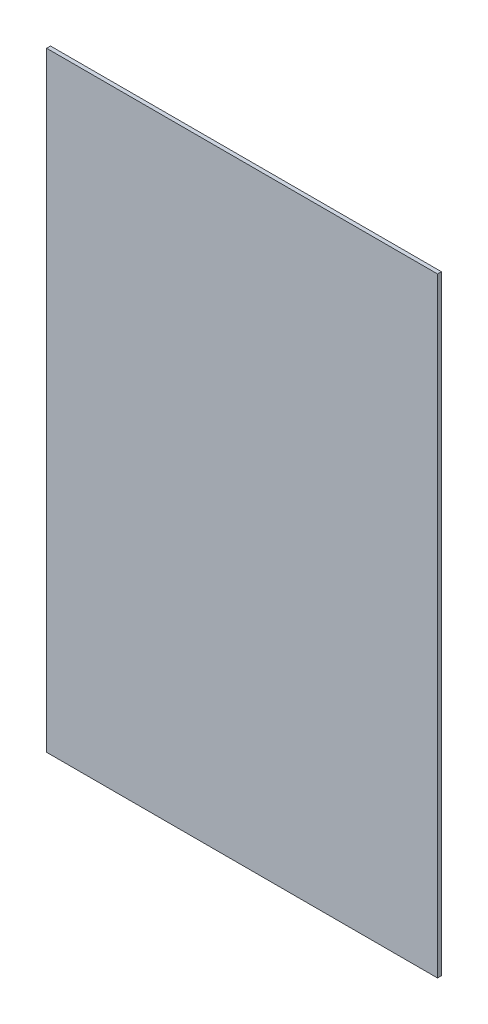
ISO-10303-21;
HEADER;
FILE_DESCRIPTION(('STEP AP214'),'2;1');
FILE_NAME('part.step','',(''),(''),'','','');
FILE_SCHEMA(('AUTOMOTIVE_DESIGN { 1 0 10303 214 1 1 1 1 }'));
ENDSEC;
DATA;
#1=APPLICATION_CONTEXT('core data for automotive mechanical design processes');
#2=APPLICATION_PROTOCOL_DEFINITION('international standard','automotive_design',2000,#1);
#3=PRODUCT_CONTEXT('',#1,'mechanical');
#4=PRODUCT('Part','Part','',(#3));
#5=PRODUCT_RELATED_PRODUCT_CATEGORY('part','',(#4));
#6=PRODUCT_DEFINITION_FORMATION('','',#4);
#7=PRODUCT_DEFINITION_CONTEXT('part definition',#1,'design');
#8=PRODUCT_DEFINITION('design','',#6,#7);
#9=PRODUCT_DEFINITION_SHAPE('','',#8);
#10=(LENGTH_UNIT() NAMED_UNIT(*) SI_UNIT(.MILLI.,.METRE.));
#11=(NAMED_UNIT(*) PLANE_ANGLE_UNIT() SI_UNIT($,.RADIAN.));
#12=(NAMED_UNIT(*) SI_UNIT($,.STERADIAN.) SOLID_ANGLE_UNIT());
#13=UNCERTAINTY_MEASURE_WITH_UNIT(LENGTH_MEASURE(1.E-05),#10,'distance_accuracy_value','');
#14=(GEOMETRIC_REPRESENTATION_CONTEXT(3) GLOBAL_UNCERTAINTY_ASSIGNED_CONTEXT((#13)) GLOBAL_UNIT_ASSIGNED_CONTEXT((#10,
#11,#12)) REPRESENTATION_CONTEXT('',''));
#15=CARTESIAN_POINT('',(0.,0.,0.));
#16=DIRECTION('',(0.,0.,1.));
#17=DIRECTION('',(1.,0.,0.));
#18=AXIS2_PLACEMENT_3D('',#15,#16,#17);
#19=CARTESIAN_POINT('',(635.,-990.6,12.7));
#20=DIRECTION('',(-1.,0.,0.));
#21=DIRECTION('',(0.,0.,1.));
#22=AXIS2_PLACEMENT_3D('',#19,#20,#21);
#23=PLANE('',#22);
#24=DIRECTION('',(0.,1.,0.));
#25=VECTOR('',#24,1.);
#26=CARTESIAN_POINT('',(635.,-990.6,0.));
#27=LINE('',#26,#25);
#28=CARTESIAN_POINT('',(635.,-990.6,0.));
#29=VERTEX_POINT('',#28);
#30=CARTESIAN_POINT('',(635.,990.6,0.));
#31=VERTEX_POINT('',#30);
#32=EDGE_CURVE('E102',#29,#31,#27,.T.);
#33=ORIENTED_EDGE('',*,*,#32,.T.);
#34=DIRECTION('',(0.,0.,-1.));
#35=VECTOR('',#34,1.);
#36=CARTESIAN_POINT('',(635.,990.6,12.7));
#37=LINE('',#36,#35);
#38=CARTESIAN_POINT('',(635.,990.6,12.7));
#39=VERTEX_POINT('',#38);
#40=EDGE_CURVE('E11',#39,#31,#37,.T.);
#41=ORIENTED_EDGE('',*,*,#40,.F.);
#42=DIRECTION('',(0.,1.,0.));
#43=VECTOR('',#42,1.);
#44=CARTESIAN_POINT('',(635.,-990.6,12.7));
#45=LINE('',#44,#43);
#46=CARTESIAN_POINT('',(635.,-990.6,12.7));
#47=VERTEX_POINT('',#46);
#48=EDGE_CURVE('E90',#47,#39,#45,.T.);
#49=ORIENTED_EDGE('',*,*,#48,.F.);
#50=DIRECTION('',(0.,0.,-1.));
#51=VECTOR('',#50,1.);
#52=CARTESIAN_POINT('',(635.,-990.6,12.7));
#53=LINE('',#52,#51);
#54=EDGE_CURVE('E98',#47,#29,#53,.T.);
#55=ORIENTED_EDGE('',*,*,#54,.T.);
#56=EDGE_LOOP('',(#33,#41,#49,#55));
#57=FACE_BOUND('',#56,.T.);
#58=ADVANCED_FACE('F39',(#57),#23,.F.);
#59=CARTESIAN_POINT('',(-635.,990.6,12.7));
#60=DIRECTION('',(0.,-1.,0.));
#61=DIRECTION('',(0.,0.,-1.));
#62=AXIS2_PLACEMENT_3D('',#59,#60,#61);
#63=PLANE('',#62);
#64=DIRECTION('',(-1.,0.,0.));
#65=VECTOR('',#64,1.);
#66=CARTESIAN_POINT('',(-635.,990.6,0.));
#67=LINE('',#66,#65);
#68=CARTESIAN_POINT('',(-635.,990.6,0.));
#69=VERTEX_POINT('',#68);
#70=EDGE_CURVE('E94',#31,#69,#67,.T.);
#71=ORIENTED_EDGE('',*,*,#70,.T.);
#72=DIRECTION('',(0.,0.,-1.));
#73=VECTOR('',#72,1.);
#74=CARTESIAN_POINT('',(-635.,990.6,12.7));
#75=LINE('',#74,#73);
#76=CARTESIAN_POINT('',(-635.,990.6,12.7));
#77=VERTEX_POINT('',#76);
#78=EDGE_CURVE('E47',#77,#69,#75,.T.);
#79=ORIENTED_EDGE('',*,*,#78,.F.);
#80=DIRECTION('',(-1.,0.,0.));
#81=VECTOR('',#80,1.);
#82=CARTESIAN_POINT('',(-635.,990.6,12.7));
#83=LINE('',#82,#81);
#84=EDGE_CURVE('E85',#39,#77,#83,.T.);
#85=ORIENTED_EDGE('',*,*,#84,.F.);
#86=ORIENTED_EDGE('',*,*,#40,.T.);
#87=EDGE_LOOP('',(#71,#79,#85,#86));
#88=FACE_BOUND('',#87,.T.);
#89=ADVANCED_FACE('F93',(#88),#63,.F.);
#90=CARTESIAN_POINT('',(-635.,-990.6,12.7));
#91=DIRECTION('',(1.,0.,0.));
#92=DIRECTION('',(0.,0.,-1.));
#93=AXIS2_PLACEMENT_3D('',#90,#91,#92);
#94=PLANE('',#93);
#95=DIRECTION('',(0.,-1.,0.));
#96=VECTOR('',#95,1.);
#97=CARTESIAN_POINT('',(-635.,-990.6,0.));
#98=LINE('',#97,#96);
#99=CARTESIAN_POINT('',(-635.,-990.6,0.));
#100=VERTEX_POINT('',#99);
#101=EDGE_CURVE('E72',#69,#100,#98,.T.);
#102=ORIENTED_EDGE('',*,*,#101,.T.);
#103=DIRECTION('',(0.,0.,-1.));
#104=VECTOR('',#103,1.);
#105=CARTESIAN_POINT('',(-635.,-990.6,12.7));
#106=LINE('',#105,#104);
#107=CARTESIAN_POINT('',(-635.,-990.6,12.7));
#108=VERTEX_POINT('',#107);
#109=EDGE_CURVE('E95',#108,#100,#106,.T.);
#110=ORIENTED_EDGE('',*,*,#109,.F.);
#111=DIRECTION('',(0.,-1.,0.));
#112=VECTOR('',#111,1.);
#113=CARTESIAN_POINT('',(-635.,-990.6,12.7));
#114=LINE('',#113,#112);
#115=EDGE_CURVE('E88',#77,#108,#114,.T.);
#116=ORIENTED_EDGE('',*,*,#115,.F.);
#117=ORIENTED_EDGE('',*,*,#78,.T.);
#118=EDGE_LOOP('',(#102,#110,#116,#117));
#119=FACE_BOUND('',#118,.T.);
#120=ADVANCED_FACE('F96',(#119),#94,.F.);
#121=CARTESIAN_POINT('',(-635.,-990.6,12.7));
#122=DIRECTION('',(0.,1.,0.));
#123=DIRECTION('',(0.,0.,1.));
#124=AXIS2_PLACEMENT_3D('',#121,#122,#123);
#125=PLANE('',#124);
#126=DIRECTION('',(1.,0.,0.));
#127=VECTOR('',#126,1.);
#128=CARTESIAN_POINT('',(-635.,-990.6,0.));
#129=LINE('',#128,#127);
#130=EDGE_CURVE('E78',#100,#29,#129,.T.);
#131=ORIENTED_EDGE('',*,*,#130,.T.);
#132=ORIENTED_EDGE('',*,*,#54,.F.);
#133=DIRECTION('',(1.,0.,0.));
#134=VECTOR('',#133,1.);
#135=CARTESIAN_POINT('',(-635.,-990.6,12.7));
#136=LINE('',#135,#134);
#137=EDGE_CURVE('E55',#108,#47,#136,.T.);
#138=ORIENTED_EDGE('',*,*,#137,.F.);
#139=ORIENTED_EDGE('',*,*,#109,.T.);
#140=EDGE_LOOP('',(#131,#132,#138,#139));
#141=FACE_BOUND('',#140,.T.);
#142=ADVANCED_FACE('F109',(#141),#125,.F.);
#143=CARTESIAN_POINT('',(0.,0.,12.7));
#144=DIRECTION('',(0.,0.,-1.));
#145=DIRECTION('',(-1.,0.,0.));
#146=AXIS2_PLACEMENT_3D('',#143,#144,#145);
#147=PLANE('',#146);
#148=ORIENTED_EDGE('',*,*,#48,.T.);
#149=ORIENTED_EDGE('',*,*,#84,.T.);
#150=ORIENTED_EDGE('',*,*,#115,.T.);
#151=ORIENTED_EDGE('',*,*,#137,.T.);
#152=EDGE_LOOP('',(#148,#149,#150,#151));
#153=FACE_BOUND('',#152,.T.);
#154=ADVANCED_FACE('F86',(#153),#147,.F.);
#155=CARTESIAN_POINT('',(0.,0.,0.));
#156=DIRECTION('',(0.,0.,-1.));
#157=DIRECTION('',(-1.,0.,0.));
#158=AXIS2_PLACEMENT_3D('',#155,#156,#157);
#159=PLANE('',#158);
#160=ORIENTED_EDGE('',*,*,#32,.F.);
#161=ORIENTED_EDGE('',*,*,#130,.F.);
#162=ORIENTED_EDGE('',*,*,#101,.F.);
#163=ORIENTED_EDGE('',*,*,#70,.F.);
#164=EDGE_LOOP('',(#160,#161,#162,#163));
#165=FACE_BOUND('',#164,.T.);
#166=ADVANCED_FACE('F112',(#165),#159,.T.);
#167=CLOSED_SHELL('',(#58,#89,#120,#142,#154,#166));
#168=MANIFOLD_SOLID_BREP('B2',#167);
#169=ADVANCED_BREP_SHAPE_REPRESENTATION('',(#18,#168),#14);
#170=SHAPE_DEFINITION_REPRESENTATION(#9,#169);
ENDSEC;
END-ISO-10303-21;
